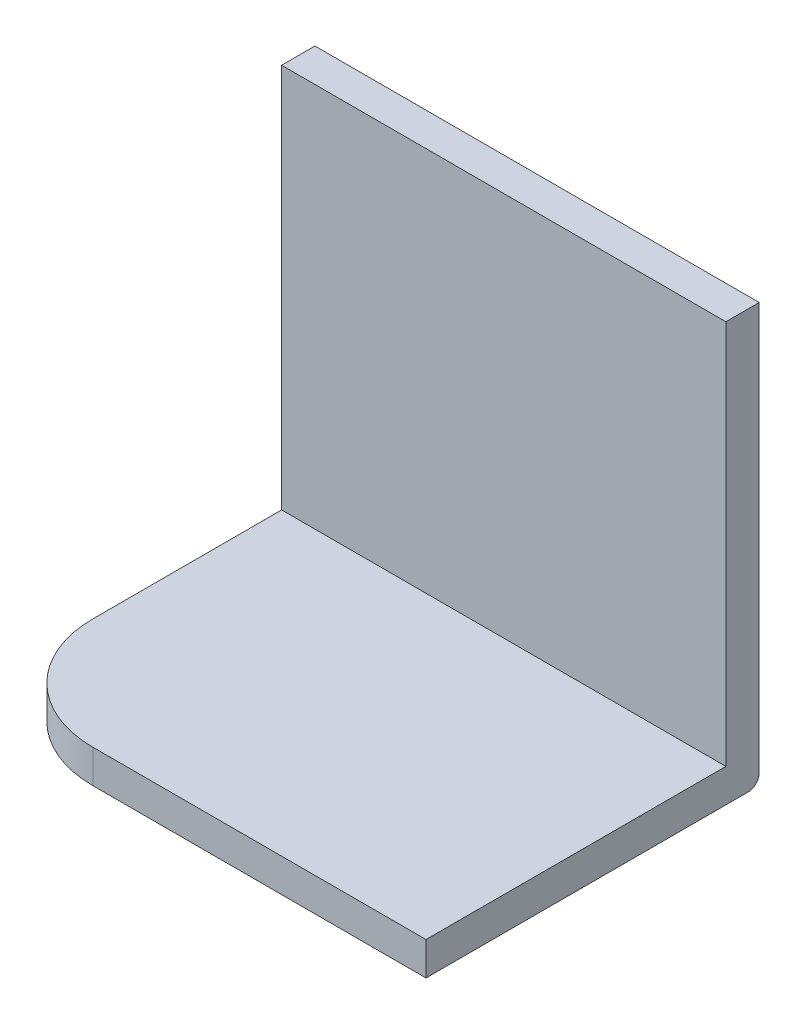
ISO-10303-21;
HEADER;
FILE_DESCRIPTION(('STEP AP214'),'2;1');
FILE_NAME('part.step','',(''),(''),'','','');
FILE_SCHEMA(('AUTOMOTIVE_DESIGN { 1 0 10303 214 1 1 1 1 }'));
ENDSEC;
DATA;
#1=APPLICATION_CONTEXT('core data for automotive mechanical design processes');
#2=APPLICATION_PROTOCOL_DEFINITION('international standard','automotive_design',2000,#1);
#3=PRODUCT_CONTEXT('',#1,'mechanical');
#4=PRODUCT('Part','Part','',(#3));
#5=PRODUCT_RELATED_PRODUCT_CATEGORY('part','',(#4));
#6=PRODUCT_DEFINITION_FORMATION('','',#4);
#7=PRODUCT_DEFINITION_CONTEXT('part definition',#1,'design');
#8=PRODUCT_DEFINITION('design','',#6,#7);
#9=PRODUCT_DEFINITION_SHAPE('','',#8);
#10=(LENGTH_UNIT() NAMED_UNIT(*) SI_UNIT(.MILLI.,.METRE.));
#11=(NAMED_UNIT(*) PLANE_ANGLE_UNIT() SI_UNIT($,.RADIAN.));
#12=(NAMED_UNIT(*) SI_UNIT($,.STERADIAN.) SOLID_ANGLE_UNIT());
#13=UNCERTAINTY_MEASURE_WITH_UNIT(LENGTH_MEASURE(1.E-05),#10,'distance_accuracy_value','');
#14=(GEOMETRIC_REPRESENTATION_CONTEXT(3) GLOBAL_UNCERTAINTY_ASSIGNED_CONTEXT((#13)) GLOBAL_UNIT_ASSIGNED_CONTEXT((#10,
#11,#12)) REPRESENTATION_CONTEXT('',''));
#15=CARTESIAN_POINT('',(0.,0.,0.));
#16=DIRECTION('',(0.,0.,1.));
#17=DIRECTION('',(1.,0.,0.));
#18=AXIS2_PLACEMENT_3D('',#15,#16,#17);
#19=CARTESIAN_POINT('',(-20.,-8.70026718146723,30.));
#20=DIRECTION('',(0.,1.,0.));
#21=DIRECTION('',(0.,0.,1.));
#22=AXIS2_PLACEMENT_3D('',#19,#20,#21);
#23=PLANE('',#22);
#24=DIRECTION('',(0.,0.,-1.));
#25=VECTOR('',#24,1.);
#26=CARTESIAN_POINT('',(20.,-8.70026718146723,30.));
#27=LINE('',#26,#25);
#28=CARTESIAN_POINT('',(20.,-8.70026718146723,30.));
#29=VERTEX_POINT('',#28);
#30=CARTESIAN_POINT('',(20.,-8.70026718146723,3.));
#31=VERTEX_POINT('',#30);
#32=EDGE_CURVE('E117',#29,#31,#27,.T.);
#33=ORIENTED_EDGE('',*,*,#32,.T.);
#34=DIRECTION('',(-1.,0.,0.));
#35=VECTOR('',#34,1.);
#36=CARTESIAN_POINT('',(20.,-8.70026718146723,3.));
#37=LINE('',#36,#35);
#38=CARTESIAN_POINT('',(-20.,-8.70026718146723,3.));
#39=VERTEX_POINT('',#38);
#40=EDGE_CURVE('E101',#31,#39,#37,.T.);
#41=ORIENTED_EDGE('',*,*,#40,.T.);
#42=DIRECTION('',(0.,0.,-1.));
#43=VECTOR('',#42,1.);
#44=CARTESIAN_POINT('',(-20.,-8.70026718146723,30.));
#45=LINE('',#44,#43);
#46=CARTESIAN_POINT('',(-20.,-8.70026718146723,20.));
#47=VERTEX_POINT('',#46);
#48=EDGE_CURVE('E126',#47,#39,#45,.T.);
#49=ORIENTED_EDGE('',*,*,#48,.F.);
#50=CARTESIAN_POINT('',(-9.99999999999998,-8.70026718146723,20.));
#51=DIRECTION('',(0.,1.,0.));
#52=DIRECTION('',(0.,0.,1.));
#53=AXIS2_PLACEMENT_3D('',#50,#51,#52);
#54=CIRCLE('',#53,10.);
#55=CARTESIAN_POINT('',(-9.99999999999998,-8.70026718146723,30.));
#56=VERTEX_POINT('',#55);
#57=EDGE_CURVE('E136',#47,#56,#54,.T.);
#58=ORIENTED_EDGE('',*,*,#57,.T.);
#59=DIRECTION('',(1.,0.,0.));
#60=VECTOR('',#59,1.);
#61=CARTESIAN_POINT('',(-20.,-8.70026718146723,30.));
#62=LINE('',#61,#60);
#63=EDGE_CURVE('E124',#56,#29,#62,.T.);
#64=ORIENTED_EDGE('',*,*,#63,.T.);
#65=EDGE_LOOP('',(#33,#41,#49,#58,#64));
#66=FACE_BOUND('',#65,.T.);
#67=ADVANCED_FACE('F39',(#66),#23,.T.);
#68=CARTESIAN_POINT('',(-20.,-11.7002671814672,30.));
#69=DIRECTION('',(0.,1.,0.));
#70=DIRECTION('',(0.,0.,1.));
#71=AXIS2_PLACEMENT_3D('',#68,#69,#70);
#72=PLANE('',#71);
#73=DIRECTION('',(0.,0.,-1.));
#74=VECTOR('',#73,1.);
#75=CARTESIAN_POINT('',(-20.,-11.7002671814672,30.));
#76=LINE('',#75,#74);
#77=CARTESIAN_POINT('',(-20.,-11.7002671814672,20.));
#78=VERTEX_POINT('',#77);
#79=CARTESIAN_POINT('',(-20.,-11.7002671814672,1.));
#80=VERTEX_POINT('',#79);
#81=EDGE_CURVE('E130',#78,#80,#76,.T.);
#82=ORIENTED_EDGE('',*,*,#81,.T.);
#83=DIRECTION('',(1.,0.,0.));
#84=VECTOR('',#83,1.);
#85=CARTESIAN_POINT('',(20.,-11.7002671814672,1.));
#86=LINE('',#85,#84);
#87=CARTESIAN_POINT('',(20.,-11.7002671814672,1.));
#88=VERTEX_POINT('',#87);
#89=EDGE_CURVE('E142',#80,#88,#86,.T.);
#90=ORIENTED_EDGE('',*,*,#89,.T.);
#91=DIRECTION('',(0.,0.,-1.));
#92=VECTOR('',#91,1.);
#93=CARTESIAN_POINT('',(20.,-11.7002671814672,30.));
#94=LINE('',#93,#92);
#95=CARTESIAN_POINT('',(20.,-11.7002671814672,30.));
#96=VERTEX_POINT('',#95);
#97=EDGE_CURVE('E125',#96,#88,#94,.T.);
#98=ORIENTED_EDGE('',*,*,#97,.F.);
#99=DIRECTION('',(1.,0.,0.));
#100=VECTOR('',#99,1.);
#101=CARTESIAN_POINT('',(-20.,-11.7002671814672,30.));
#102=LINE('',#101,#100);
#103=CARTESIAN_POINT('',(-9.99999999999998,-11.7002671814672,30.));
#104=VERTEX_POINT('',#103);
#105=EDGE_CURVE('E170',#104,#96,#102,.T.);
#106=ORIENTED_EDGE('',*,*,#105,.F.);
#107=CARTESIAN_POINT('',(-9.99999999999998,-11.7002671814672,20.));
#108=DIRECTION('',(0.,1.,0.));
#109=DIRECTION('',(0.,0.,1.));
#110=AXIS2_PLACEMENT_3D('',#107,#108,#109);
#111=CIRCLE('',#110,10.);
#112=EDGE_CURVE('E140',#104,#78,#111,.F.);
#113=ORIENTED_EDGE('',*,*,#112,.T.);
#114=EDGE_LOOP('',(#82,#90,#98,#106,#113));
#115=FACE_BOUND('',#114,.T.);
#116=ADVANCED_FACE('F164',(#115),#72,.F.);
#117=CARTESIAN_POINT('',(20.,-8.70026718146723,30.));
#118=DIRECTION('',(1.,0.,0.));
#119=DIRECTION('',(0.,0.,-1.));
#120=AXIS2_PLACEMENT_3D('',#117,#118,#119);
#121=PLANE('',#120);
#122=ORIENTED_EDGE('',*,*,#97,.T.);
#123=CARTESIAN_POINT('',(20.,-10.7002671814672,1.));
#124=DIRECTION('',(1.,0.,0.));
#125=DIRECTION('',(0.,0.,-1.));
#126=AXIS2_PLACEMENT_3D('',#123,#124,#125);
#127=CIRCLE('',#126,1.);
#128=CARTESIAN_POINT('',(20.,-10.7002671814672,0.));
#129=VERTEX_POINT('',#128);
#130=EDGE_CURVE('E145',#88,#129,#127,.T.);
#131=ORIENTED_EDGE('',*,*,#130,.T.);
#132=DIRECTION('',(0.,-1.,0.));
#133=VECTOR('',#132,1.);
#134=CARTESIAN_POINT('',(20.,-8.70026718146723,0.));
#135=LINE('',#134,#133);
#136=CARTESIAN_POINT('',(20.,25.974293860845,0.));
#137=VERTEX_POINT('',#136);
#138=EDGE_CURVE('E146',#137,#129,#135,.T.);
#139=ORIENTED_EDGE('',*,*,#138,.F.);
#140=DIRECTION('',(0.,0.,1.));
#141=VECTOR('',#140,1.);
#142=CARTESIAN_POINT('',(20.,25.974293860845,0.));
#143=LINE('',#142,#141);
#144=CARTESIAN_POINT('',(20.,25.974293860845,3.));
#145=VERTEX_POINT('',#144);
#146=EDGE_CURVE('E110',#137,#145,#143,.T.);
#147=ORIENTED_EDGE('',*,*,#146,.T.);
#148=DIRECTION('',(0.,1.,0.));
#149=VECTOR('',#148,1.);
#150=CARTESIAN_POINT('',(20.,-8.70026718146723,3.));
#151=LINE('',#150,#149);
#152=EDGE_CURVE('E104',#31,#145,#151,.T.);
#153=ORIENTED_EDGE('',*,*,#152,.F.);
#154=ORIENTED_EDGE('',*,*,#32,.F.);
#155=DIRECTION('',(0.,-1.,0.));
#156=VECTOR('',#155,1.);
#157=CARTESIAN_POINT('',(20.,-8.70026718146723,30.));
#158=LINE('',#157,#156);
#159=EDGE_CURVE('E167',#29,#96,#158,.T.);
#160=ORIENTED_EDGE('',*,*,#159,.T.);
#161=EDGE_LOOP('',(#122,#131,#139,#147,#153,#154,#160));
#162=FACE_BOUND('',#161,.T.);
#163=ADVANCED_FACE('F115',(#162),#121,.T.);
#164=CARTESIAN_POINT('',(-20.,-11.7002671814672,30.));
#165=DIRECTION('',(-1.,0.,0.));
#166=DIRECTION('',(0.,0.,1.));
#167=AXIS2_PLACEMENT_3D('',#164,#165,#166);
#168=PLANE('',#167);
#169=DIRECTION('',(0.,1.,0.));
#170=VECTOR('',#169,1.);
#171=CARTESIAN_POINT('',(-20.,-11.7002671814672,0.));
#172=LINE('',#171,#170);
#173=CARTESIAN_POINT('',(-20.,-10.7002671814672,0.));
#174=VERTEX_POINT('',#173);
#175=CARTESIAN_POINT('',(-20.,25.974293860845,0.));
#176=VERTEX_POINT('',#175);
#177=EDGE_CURVE('E154',#174,#176,#172,.T.);
#178=ORIENTED_EDGE('',*,*,#177,.F.);
#179=CARTESIAN_POINT('',(-20.,-10.7002671814672,1.));
#180=DIRECTION('',(-1.,0.,0.));
#181=DIRECTION('',(0.,0.,1.));
#182=AXIS2_PLACEMENT_3D('',#179,#180,#181);
#183=CIRCLE('',#182,1.);
#184=EDGE_CURVE('E11',#174,#80,#183,.T.);
#185=ORIENTED_EDGE('',*,*,#184,.T.);
#186=ORIENTED_EDGE('',*,*,#81,.F.);
#187=DIRECTION('',(0.,1.,0.));
#188=VECTOR('',#187,1.);
#189=CARTESIAN_POINT('',(-20.,-8.70026718146723,20.));
#190=LINE('',#189,#188);
#191=EDGE_CURVE('E128',#78,#47,#190,.T.);
#192=ORIENTED_EDGE('',*,*,#191,.T.);
#193=ORIENTED_EDGE('',*,*,#48,.T.);
#194=DIRECTION('',(0.,1.,0.));
#195=VECTOR('',#194,1.);
#196=CARTESIAN_POINT('',(-20.,-8.70026718146723,3.));
#197=LINE('',#196,#195);
#198=CARTESIAN_POINT('',(-20.,25.974293860845,3.));
#199=VERTEX_POINT('',#198);
#200=EDGE_CURVE('E54',#39,#199,#197,.T.);
#201=ORIENTED_EDGE('',*,*,#200,.T.);
#202=DIRECTION('',(0.,0.,1.));
#203=VECTOR('',#202,1.);
#204=CARTESIAN_POINT('',(-20.,25.974293860845,0.));
#205=LINE('',#204,#203);
#206=EDGE_CURVE('E121',#176,#199,#205,.T.);
#207=ORIENTED_EDGE('',*,*,#206,.F.);
#208=EDGE_LOOP('',(#178,#185,#186,#192,#193,#201,#207));
#209=FACE_BOUND('',#208,.T.);
#210=ADVANCED_FACE('F160',(#209),#168,.T.);
#211=CARTESIAN_POINT('',(0.,0.,30.));
#212=DIRECTION('',(0.,0.,-1.));
#213=DIRECTION('',(-1.,0.,0.));
#214=AXIS2_PLACEMENT_3D('',#211,#212,#213);
#215=PLANE('',#214);
#216=ORIENTED_EDGE('',*,*,#63,.F.);
#217=DIRECTION('',(0.,1.,0.));
#218=VECTOR('',#217,1.);
#219=CARTESIAN_POINT('',(-9.99999999999998,-11.7002671814672,30.));
#220=LINE('',#219,#218);
#221=EDGE_CURVE('E138',#56,#104,#220,.F.);
#222=ORIENTED_EDGE('',*,*,#221,.T.);
#223=ORIENTED_EDGE('',*,*,#105,.T.);
#224=ORIENTED_EDGE('',*,*,#159,.F.);
#225=EDGE_LOOP('',(#216,#222,#223,#224));
#226=FACE_BOUND('',#225,.T.);
#227=ADVANCED_FACE('F182',(#226),#215,.F.);
#228=CARTESIAN_POINT('',(0.,0.,0.));
#229=DIRECTION('',(0.,0.,-1.));
#230=DIRECTION('',(-1.,0.,0.));
#231=AXIS2_PLACEMENT_3D('',#228,#229,#230);
#232=PLANE('',#231);
#233=ORIENTED_EDGE('',*,*,#138,.T.);
#234=DIRECTION('',(1.,0.,0.));
#235=VECTOR('',#234,1.);
#236=CARTESIAN_POINT('',(-20.,-10.7002671814672,0.));
#237=LINE('',#236,#235);
#238=EDGE_CURVE('E47',#129,#174,#237,.F.);
#239=ORIENTED_EDGE('',*,*,#238,.T.);
#240=ORIENTED_EDGE('',*,*,#177,.T.);
#241=DIRECTION('',(-1.,0.,0.));
#242=VECTOR('',#241,1.);
#243=CARTESIAN_POINT('',(20.,25.974293860845,0.));
#244=LINE('',#243,#242);
#245=EDGE_CURVE('E153',#137,#176,#244,.T.);
#246=ORIENTED_EDGE('',*,*,#245,.F.);
#247=EDGE_LOOP('',(#233,#239,#240,#246));
#248=FACE_BOUND('',#247,.T.);
#249=ADVANCED_FACE('F151',(#248),#232,.T.);
#250=CARTESIAN_POINT('',(-9.99999999999998,-11.7002671814672,20.));
#251=DIRECTION('',(0.,-1.,0.));
#252=DIRECTION('',(0.,0.,-1.));
#253=AXIS2_PLACEMENT_3D('',#250,#251,#252);
#254=CYLINDRICAL_SURFACE('',#253,10.);
#255=ORIENTED_EDGE('',*,*,#112,.F.);
#256=ORIENTED_EDGE('',*,*,#221,.F.);
#257=ORIENTED_EDGE('',*,*,#57,.F.);
#258=ORIENTED_EDGE('',*,*,#191,.F.);
#259=EDGE_LOOP('',(#255,#256,#257,#258));
#260=FACE_BOUND('',#259,.T.);
#261=ADVANCED_FACE('F183',(#260),#254,.T.);
#262=CARTESIAN_POINT('',(-20.,-10.7002671814672,1.));
#263=DIRECTION('',(-1.,0.,0.));
#264=DIRECTION('',(0.,0.,1.));
#265=AXIS2_PLACEMENT_3D('',#262,#263,#264);
#266=CYLINDRICAL_SURFACE('',#265,1.);
#267=ORIENTED_EDGE('',*,*,#184,.F.);
#268=ORIENTED_EDGE('',*,*,#238,.F.);
#269=ORIENTED_EDGE('',*,*,#130,.F.);
#270=ORIENTED_EDGE('',*,*,#89,.F.);
#271=EDGE_LOOP('',(#267,#268,#269,#270));
#272=FACE_BOUND('',#271,.T.);
#273=ADVANCED_FACE('F41',(#272),#266,.T.);
#274=CARTESIAN_POINT('',(20.,25.974293860845,0.));
#275=DIRECTION('',(0.,-1.,0.));
#276=DIRECTION('',(0.,0.,-1.));
#277=AXIS2_PLACEMENT_3D('',#274,#275,#276);
#278=PLANE('',#277);
#279=ORIENTED_EDGE('',*,*,#206,.T.);
#280=DIRECTION('',(-1.,0.,0.));
#281=VECTOR('',#280,1.);
#282=CARTESIAN_POINT('',(20.,25.974293860845,3.));
#283=LINE('',#282,#281);
#284=EDGE_CURVE('E109',#145,#199,#283,.T.);
#285=ORIENTED_EDGE('',*,*,#284,.F.);
#286=ORIENTED_EDGE('',*,*,#146,.F.);
#287=ORIENTED_EDGE('',*,*,#245,.T.);
#288=EDGE_LOOP('',(#279,#285,#286,#287));
#289=FACE_BOUND('',#288,.T.);
#290=ADVANCED_FACE('F189',(#289),#278,.F.);
#291=CARTESIAN_POINT('',(20.,-8.70026718146723,3.));
#292=DIRECTION('',(0.,0.,1.));
#293=DIRECTION('',(1.,0.,0.));
#294=AXIS2_PLACEMENT_3D('',#291,#292,#293);
#295=PLANE('',#294);
#296=ORIENTED_EDGE('',*,*,#200,.F.);
#297=ORIENTED_EDGE('',*,*,#40,.F.);
#298=ORIENTED_EDGE('',*,*,#152,.T.);
#299=ORIENTED_EDGE('',*,*,#284,.T.);
#300=EDGE_LOOP('',(#296,#297,#298,#299));
#301=FACE_BOUND('',#300,.T.);
#302=ADVANCED_FACE('F103',(#301),#295,.T.);
#303=CLOSED_SHELL('',(#67,#116,#163,#210,#227,#249,#261,#273,#290,#302));
#304=MANIFOLD_SOLID_BREP('B2',#303);
#305=ADVANCED_BREP_SHAPE_REPRESENTATION('',(#18,#304),#14);
#306=SHAPE_DEFINITION_REPRESENTATION(#9,#305);
ENDSEC;
END-ISO-10303-21;
